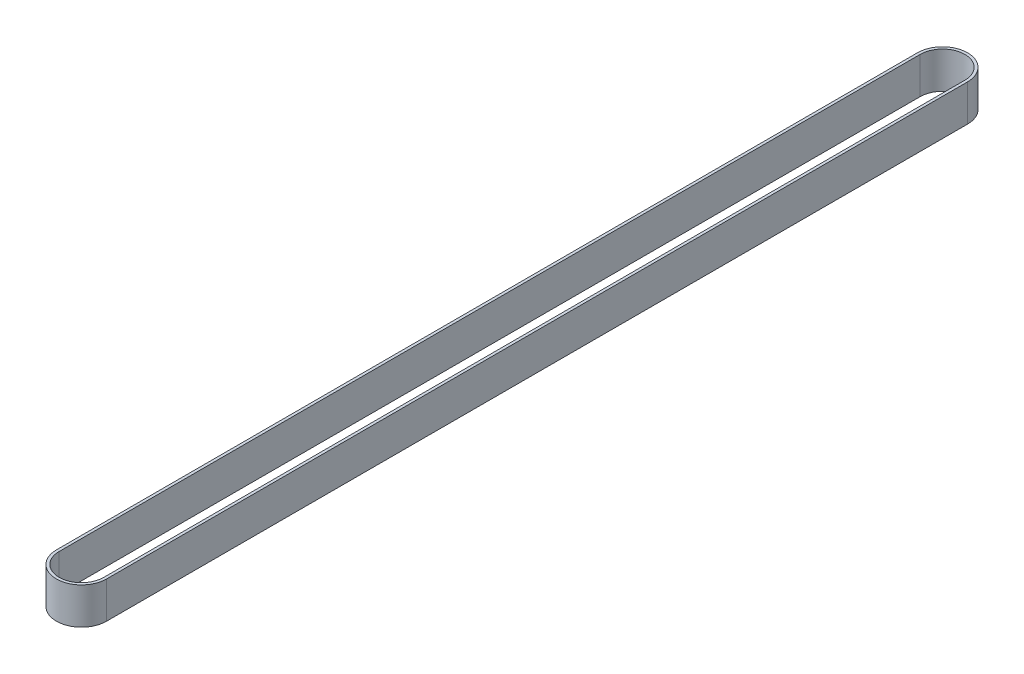
ISO-10303-21;
HEADER;
FILE_DESCRIPTION(('STEP AP214'),'2;1');
FILE_NAME('part.step','',(''),(''),'','','');
FILE_SCHEMA(('AUTOMOTIVE_DESIGN { 1 0 10303 214 1 1 1 1 }'));
ENDSEC;
DATA;
#1=APPLICATION_CONTEXT('core data for automotive mechanical design processes');
#2=APPLICATION_PROTOCOL_DEFINITION('international standard','automotive_design',2000,#1);
#3=PRODUCT_CONTEXT('',#1,'mechanical');
#4=PRODUCT('Part','Part','',(#3));
#5=PRODUCT_RELATED_PRODUCT_CATEGORY('part','',(#4));
#6=PRODUCT_DEFINITION_FORMATION('','',#4);
#7=PRODUCT_DEFINITION_CONTEXT('part definition',#1,'design');
#8=PRODUCT_DEFINITION('design','',#6,#7);
#9=PRODUCT_DEFINITION_SHAPE('','',#8);
#10=(LENGTH_UNIT() NAMED_UNIT(*) SI_UNIT(.MILLI.,.METRE.));
#11=(NAMED_UNIT(*) PLANE_ANGLE_UNIT() SI_UNIT($,.RADIAN.));
#12=(NAMED_UNIT(*) SI_UNIT($,.STERADIAN.) SOLID_ANGLE_UNIT());
#13=UNCERTAINTY_MEASURE_WITH_UNIT(LENGTH_MEASURE(1.E-05),#10,'distance_accuracy_value','');
#14=(GEOMETRIC_REPRESENTATION_CONTEXT(3) GLOBAL_UNCERTAINTY_ASSIGNED_CONTEXT((#13)) GLOBAL_UNIT_ASSIGNED_CONTEXT((#10,
#11,#12)) REPRESENTATION_CONTEXT('',''));
#15=CARTESIAN_POINT('',(0.,0.,0.));
#16=DIRECTION('',(0.,0.,1.));
#17=DIRECTION('',(1.,0.,0.));
#18=AXIS2_PLACEMENT_3D('',#15,#16,#17);
#19=CARTESIAN_POINT('',(0.,10.,117.55));
#20=DIRECTION('',(0.,1.,0.));
#21=DIRECTION('',(0.,0.,1.));
#22=AXIS2_PLACEMENT_3D('',#19,#20,#21);
#23=PLANE('',#22);
#24=CARTESIAN_POINT('',(0.,10.,117.55));
#25=DIRECTION('',(0.,1.,0.));
#26=DIRECTION('',(0.,0.,1.));
#27=AXIS2_PLACEMENT_3D('',#24,#25,#26);
#28=CIRCLE('',#27,6.86000000000003);
#29=CARTESIAN_POINT('',(-6.86000000000003,10.,117.55));
#30=VERTEX_POINT('',#29);
#31=CARTESIAN_POINT('',(6.86000000000003,10.,117.55));
#32=VERTEX_POINT('',#31);
#33=EDGE_CURVE('E141',#30,#32,#28,.T.);
#34=ORIENTED_EDGE('',*,*,#33,.T.);
#35=DIRECTION('',(0.,0.,-1.));
#36=VECTOR('',#35,1.);
#37=CARTESIAN_POINT('',(6.86000000000003,10.,117.55));
#38=LINE('',#37,#36);
#39=CARTESIAN_POINT('',(6.86,10.,-117.55));
#40=VERTEX_POINT('',#39);
#41=EDGE_CURVE('E144',#32,#40,#38,.T.);
#42=ORIENTED_EDGE('',*,*,#41,.T.);
#43=CARTESIAN_POINT('',(0.,10.,-117.55));
#44=DIRECTION('',(0.,1.,0.));
#45=DIRECTION('',(0.,0.,1.));
#46=AXIS2_PLACEMENT_3D('',#43,#44,#45);
#47=CIRCLE('',#46,6.86000000000003);
#48=CARTESIAN_POINT('',(-6.86000000000006,10.,-117.55));
#49=VERTEX_POINT('',#48);
#50=EDGE_CURVE('E147',#40,#49,#47,.T.);
#51=ORIENTED_EDGE('',*,*,#50,.T.);
#52=DIRECTION('',(0.,0.,1.));
#53=VECTOR('',#52,1.);
#54=CARTESIAN_POINT('',(-6.86000000000003,10.,117.55));
#55=LINE('',#54,#53);
#56=EDGE_CURVE('E149',#49,#30,#55,.T.);
#57=ORIENTED_EDGE('',*,*,#56,.T.);
#58=EDGE_LOOP('',(#34,#42,#51,#57));
#59=FACE_BOUND('',#58,.T.);
#60=DIRECTION('',(0.,0.,-1.));
#61=VECTOR('',#60,1.);
#62=CARTESIAN_POINT('',(6.11000000000008,10.,117.55));
#63=LINE('',#62,#61);
#64=CARTESIAN_POINT('',(6.11000000000008,10.,117.55));
#65=VERTEX_POINT('',#64);
#66=CARTESIAN_POINT('',(6.11000000000003,10.,-117.55));
#67=VERTEX_POINT('',#66);
#68=EDGE_CURVE('E113',#65,#67,#63,.T.);
#69=ORIENTED_EDGE('',*,*,#68,.F.);
#70=CARTESIAN_POINT('',(0.,10.,117.55));
#71=DIRECTION('',(0.,1.,0.));
#72=DIRECTION('',(0.,0.,1.));
#73=AXIS2_PLACEMENT_3D('',#70,#71,#72);
#74=CIRCLE('',#73,6.11);
#75=CARTESIAN_POINT('',(-6.10999999999992,10.,117.55));
#76=VERTEX_POINT('',#75);
#77=EDGE_CURVE('E105',#76,#65,#74,.T.);
#78=ORIENTED_EDGE('',*,*,#77,.F.);
#79=DIRECTION('',(0.,0.,1.));
#80=VECTOR('',#79,1.);
#81=CARTESIAN_POINT('',(-6.10999999999992,10.,117.55));
#82=LINE('',#81,#80);
#83=CARTESIAN_POINT('',(-6.10999999999997,10.,-117.55));
#84=VERTEX_POINT('',#83);
#85=EDGE_CURVE('E127',#84,#76,#82,.T.);
#86=ORIENTED_EDGE('',*,*,#85,.F.);
#87=CARTESIAN_POINT('',(0.,10.,-117.55));
#88=DIRECTION('',(0.,1.,0.));
#89=DIRECTION('',(0.,0.,1.));
#90=AXIS2_PLACEMENT_3D('',#87,#88,#89);
#91=CIRCLE('',#90,6.11);
#92=EDGE_CURVE('E125',#67,#84,#91,.T.);
#93=ORIENTED_EDGE('',*,*,#92,.F.);
#94=EDGE_LOOP('',(#69,#78,#86,#93));
#95=FACE_BOUND('',#94,.T.);
#96=ADVANCED_FACE('F40',(#59,#95),#23,.T.);
#97=CARTESIAN_POINT('',(0.,0.,117.55));
#98=DIRECTION('',(0.,1.,0.));
#99=DIRECTION('',(0.,0.,1.));
#100=AXIS2_PLACEMENT_3D('',#97,#98,#99);
#101=PLANE('',#100);
#102=CARTESIAN_POINT('',(0.,0.,117.55));
#103=DIRECTION('',(0.,1.,0.));
#104=DIRECTION('',(0.,0.,1.));
#105=AXIS2_PLACEMENT_3D('',#102,#103,#104);
#106=CIRCLE('',#105,6.86000000000003);
#107=CARTESIAN_POINT('',(-6.86000000000003,0.,117.55));
#108=VERTEX_POINT('',#107);
#109=CARTESIAN_POINT('',(6.86000000000003,0.,117.55));
#110=VERTEX_POINT('',#109);
#111=EDGE_CURVE('E121',#108,#110,#106,.T.);
#112=ORIENTED_EDGE('',*,*,#111,.F.);
#113=DIRECTION('',(0.,0.,1.));
#114=VECTOR('',#113,1.);
#115=CARTESIAN_POINT('',(-6.86000000000003,0.,117.55));
#116=LINE('',#115,#114);
#117=CARTESIAN_POINT('',(-6.86000000000006,0.,-117.55));
#118=VERTEX_POINT('',#117);
#119=EDGE_CURVE('E145',#118,#108,#116,.T.);
#120=ORIENTED_EDGE('',*,*,#119,.F.);
#121=CARTESIAN_POINT('',(0.,0.,-117.55));
#122=DIRECTION('',(0.,1.,0.));
#123=DIRECTION('',(0.,0.,1.));
#124=AXIS2_PLACEMENT_3D('',#121,#122,#123);
#125=CIRCLE('',#124,6.86000000000003);
#126=CARTESIAN_POINT('',(6.86,0.,-117.55));
#127=VERTEX_POINT('',#126);
#128=EDGE_CURVE('E156',#127,#118,#125,.T.);
#129=ORIENTED_EDGE('',*,*,#128,.F.);
#130=DIRECTION('',(0.,0.,-1.));
#131=VECTOR('',#130,1.);
#132=CARTESIAN_POINT('',(6.86000000000003,0.,117.55));
#133=LINE('',#132,#131);
#134=EDGE_CURVE('E154',#110,#127,#133,.T.);
#135=ORIENTED_EDGE('',*,*,#134,.F.);
#136=EDGE_LOOP('',(#112,#120,#129,#135));
#137=FACE_BOUND('',#136,.T.);
#138=CARTESIAN_POINT('',(0.,0.,117.55));
#139=DIRECTION('',(0.,1.,0.));
#140=DIRECTION('',(0.,0.,1.));
#141=AXIS2_PLACEMENT_3D('',#138,#139,#140);
#142=CIRCLE('',#141,6.11);
#143=CARTESIAN_POINT('',(-6.10999999999992,0.,117.55));
#144=VERTEX_POINT('',#143);
#145=CARTESIAN_POINT('',(6.11000000000008,0.,117.55));
#146=VERTEX_POINT('',#145);
#147=EDGE_CURVE('E63',#144,#146,#142,.T.);
#148=ORIENTED_EDGE('',*,*,#147,.T.);
#149=DIRECTION('',(0.,0.,-1.));
#150=VECTOR('',#149,1.);
#151=CARTESIAN_POINT('',(6.11000000000008,0.,117.55));
#152=LINE('',#151,#150);
#153=CARTESIAN_POINT('',(6.11000000000003,0.,-117.55));
#154=VERTEX_POINT('',#153);
#155=EDGE_CURVE('E120',#146,#154,#152,.T.);
#156=ORIENTED_EDGE('',*,*,#155,.T.);
#157=CARTESIAN_POINT('',(0.,0.,-117.55));
#158=DIRECTION('',(0.,1.,0.));
#159=DIRECTION('',(0.,0.,1.));
#160=AXIS2_PLACEMENT_3D('',#157,#158,#159);
#161=CIRCLE('',#160,6.11);
#162=CARTESIAN_POINT('',(-6.10999999999997,0.,-117.55));
#163=VERTEX_POINT('',#162);
#164=EDGE_CURVE('E133',#154,#163,#161,.T.);
#165=ORIENTED_EDGE('',*,*,#164,.T.);
#166=DIRECTION('',(0.,0.,1.));
#167=VECTOR('',#166,1.);
#168=CARTESIAN_POINT('',(-6.10999999999992,0.,117.55));
#169=LINE('',#168,#167);
#170=EDGE_CURVE('E114',#163,#144,#169,.T.);
#171=ORIENTED_EDGE('',*,*,#170,.T.);
#172=EDGE_LOOP('',(#148,#156,#165,#171));
#173=FACE_BOUND('',#172,.T.);
#174=ADVANCED_FACE('F174',(#137,#173),#101,.F.);
#175=CARTESIAN_POINT('',(0.,10.,117.55));
#176=DIRECTION('',(0.,-1.,0.));
#177=DIRECTION('',(0.,0.,-1.));
#178=AXIS2_PLACEMENT_3D('',#175,#176,#177);
#179=CYLINDRICAL_SURFACE('',#178,6.86000000000003);
#180=ORIENTED_EDGE('',*,*,#111,.T.);
#181=DIRECTION('',(0.,-1.,0.));
#182=VECTOR('',#181,1.);
#183=CARTESIAN_POINT('',(6.86000000000003,10.,117.55));
#184=LINE('',#183,#182);
#185=EDGE_CURVE('E11',#32,#110,#184,.T.);
#186=ORIENTED_EDGE('',*,*,#185,.F.);
#187=ORIENTED_EDGE('',*,*,#33,.F.);
#188=DIRECTION('',(0.,-1.,0.));
#189=VECTOR('',#188,1.);
#190=CARTESIAN_POINT('',(-6.86000000000003,10.,117.55));
#191=LINE('',#190,#189);
#192=EDGE_CURVE('E151',#30,#108,#191,.T.);
#193=ORIENTED_EDGE('',*,*,#192,.T.);
#194=EDGE_LOOP('',(#180,#186,#187,#193));
#195=FACE_BOUND('',#194,.T.);
#196=ADVANCED_FACE('F42',(#195),#179,.T.);
#197=CARTESIAN_POINT('',(6.86000000000003,10.,117.55));
#198=DIRECTION('',(-1.,0.,0.));
#199=DIRECTION('',(0.,0.,1.));
#200=AXIS2_PLACEMENT_3D('',#197,#198,#199);
#201=PLANE('',#200);
#202=ORIENTED_EDGE('',*,*,#134,.T.);
#203=DIRECTION('',(0.,-1.,0.));
#204=VECTOR('',#203,1.);
#205=CARTESIAN_POINT('',(6.86,10.,-117.55));
#206=LINE('',#205,#204);
#207=EDGE_CURVE('E48',#40,#127,#206,.T.);
#208=ORIENTED_EDGE('',*,*,#207,.F.);
#209=ORIENTED_EDGE('',*,*,#41,.F.);
#210=ORIENTED_EDGE('',*,*,#185,.T.);
#211=EDGE_LOOP('',(#202,#208,#209,#210));
#212=FACE_BOUND('',#211,.T.);
#213=ADVANCED_FACE('F184',(#212),#201,.F.);
#214=CARTESIAN_POINT('',(0.,10.,-117.55));
#215=DIRECTION('',(0.,-1.,0.));
#216=DIRECTION('',(0.,0.,-1.));
#217=AXIS2_PLACEMENT_3D('',#214,#215,#216);
#218=CYLINDRICAL_SURFACE('',#217,6.86000000000003);
#219=ORIENTED_EDGE('',*,*,#128,.T.);
#220=DIRECTION('',(0.,-1.,0.));
#221=VECTOR('',#220,1.);
#222=CARTESIAN_POINT('',(-6.86000000000006,10.,-117.55));
#223=LINE('',#222,#221);
#224=EDGE_CURVE('E161',#49,#118,#223,.T.);
#225=ORIENTED_EDGE('',*,*,#224,.F.);
#226=ORIENTED_EDGE('',*,*,#50,.F.);
#227=ORIENTED_EDGE('',*,*,#207,.T.);
#228=EDGE_LOOP('',(#219,#225,#226,#227));
#229=FACE_BOUND('',#228,.T.);
#230=ADVANCED_FACE('F168',(#229),#218,.T.);
#231=CARTESIAN_POINT('',(-6.86000000000003,10.,117.55));
#232=DIRECTION('',(1.,0.,0.));
#233=DIRECTION('',(0.,0.,-1.));
#234=AXIS2_PLACEMENT_3D('',#231,#232,#233);
#235=PLANE('',#234);
#236=ORIENTED_EDGE('',*,*,#119,.T.);
#237=ORIENTED_EDGE('',*,*,#192,.F.);
#238=ORIENTED_EDGE('',*,*,#56,.F.);
#239=ORIENTED_EDGE('',*,*,#224,.T.);
#240=EDGE_LOOP('',(#236,#237,#238,#239));
#241=FACE_BOUND('',#240,.T.);
#242=ADVANCED_FACE('F178',(#241),#235,.F.);
#243=CARTESIAN_POINT('',(0.,10.,117.55));
#244=DIRECTION('',(0.,-1.,0.));
#245=DIRECTION('',(0.,0.,-1.));
#246=AXIS2_PLACEMENT_3D('',#243,#244,#245);
#247=CYLINDRICAL_SURFACE('',#246,6.11);
#248=ORIENTED_EDGE('',*,*,#147,.F.);
#249=DIRECTION('',(0.,-1.,0.));
#250=VECTOR('',#249,1.);
#251=CARTESIAN_POINT('',(-6.10999999999992,10.,117.55));
#252=LINE('',#251,#250);
#253=EDGE_CURVE('E109',#76,#144,#252,.T.);
#254=ORIENTED_EDGE('',*,*,#253,.F.);
#255=ORIENTED_EDGE('',*,*,#77,.T.);
#256=DIRECTION('',(0.,-1.,0.));
#257=VECTOR('',#256,1.);
#258=CARTESIAN_POINT('',(6.11000000000008,10.,117.55));
#259=LINE('',#258,#257);
#260=EDGE_CURVE('E108',#65,#146,#259,.T.);
#261=ORIENTED_EDGE('',*,*,#260,.T.);
#262=EDGE_LOOP('',(#248,#254,#255,#261));
#263=FACE_BOUND('',#262,.T.);
#264=ADVANCED_FACE('F107',(#263),#247,.F.);
#265=CARTESIAN_POINT('',(6.11000000000008,10.,117.55));
#266=DIRECTION('',(-1.,0.,0.));
#267=DIRECTION('',(0.,0.,1.));
#268=AXIS2_PLACEMENT_3D('',#265,#266,#267);
#269=PLANE('',#268);
#270=ORIENTED_EDGE('',*,*,#155,.F.);
#271=ORIENTED_EDGE('',*,*,#260,.F.);
#272=ORIENTED_EDGE('',*,*,#68,.T.);
#273=DIRECTION('',(0.,-1.,0.));
#274=VECTOR('',#273,1.);
#275=CARTESIAN_POINT('',(6.11000000000003,10.,-117.55));
#276=LINE('',#275,#274);
#277=EDGE_CURVE('E122',#67,#154,#276,.T.);
#278=ORIENTED_EDGE('',*,*,#277,.T.);
#279=EDGE_LOOP('',(#270,#271,#272,#278));
#280=FACE_BOUND('',#279,.T.);
#281=ADVANCED_FACE('F117',(#280),#269,.T.);
#282=CARTESIAN_POINT('',(0.,10.,-117.55));
#283=DIRECTION('',(0.,-1.,0.));
#284=DIRECTION('',(0.,0.,-1.));
#285=AXIS2_PLACEMENT_3D('',#282,#283,#284);
#286=CYLINDRICAL_SURFACE('',#285,6.11);
#287=ORIENTED_EDGE('',*,*,#164,.F.);
#288=ORIENTED_EDGE('',*,*,#277,.F.);
#289=ORIENTED_EDGE('',*,*,#92,.T.);
#290=DIRECTION('',(0.,-1.,0.));
#291=VECTOR('',#290,1.);
#292=CARTESIAN_POINT('',(-6.10999999999997,10.,-117.55));
#293=LINE('',#292,#291);
#294=EDGE_CURVE('E55',#84,#163,#293,.T.);
#295=ORIENTED_EDGE('',*,*,#294,.T.);
#296=EDGE_LOOP('',(#287,#288,#289,#295));
#297=FACE_BOUND('',#296,.T.);
#298=ADVANCED_FACE('F207',(#297),#286,.F.);
#299=CARTESIAN_POINT('',(-6.10999999999992,10.,117.55));
#300=DIRECTION('',(1.,0.,0.));
#301=DIRECTION('',(0.,0.,-1.));
#302=AXIS2_PLACEMENT_3D('',#299,#300,#301);
#303=PLANE('',#302);
#304=ORIENTED_EDGE('',*,*,#170,.F.);
#305=ORIENTED_EDGE('',*,*,#294,.F.);
#306=ORIENTED_EDGE('',*,*,#85,.T.);
#307=ORIENTED_EDGE('',*,*,#253,.T.);
#308=EDGE_LOOP('',(#304,#305,#306,#307));
#309=FACE_BOUND('',#308,.T.);
#310=ADVANCED_FACE('F211',(#309),#303,.T.);
#311=CLOSED_SHELL('',(#96,#174,#196,#213,#230,#242,#264,#281,#298,#310));
#312=MANIFOLD_SOLID_BREP('B2',#311);
#313=ADVANCED_BREP_SHAPE_REPRESENTATION('',(#18,#312),#14);
#314=SHAPE_DEFINITION_REPRESENTATION(#9,#313);
ENDSEC;
END-ISO-10303-21;
